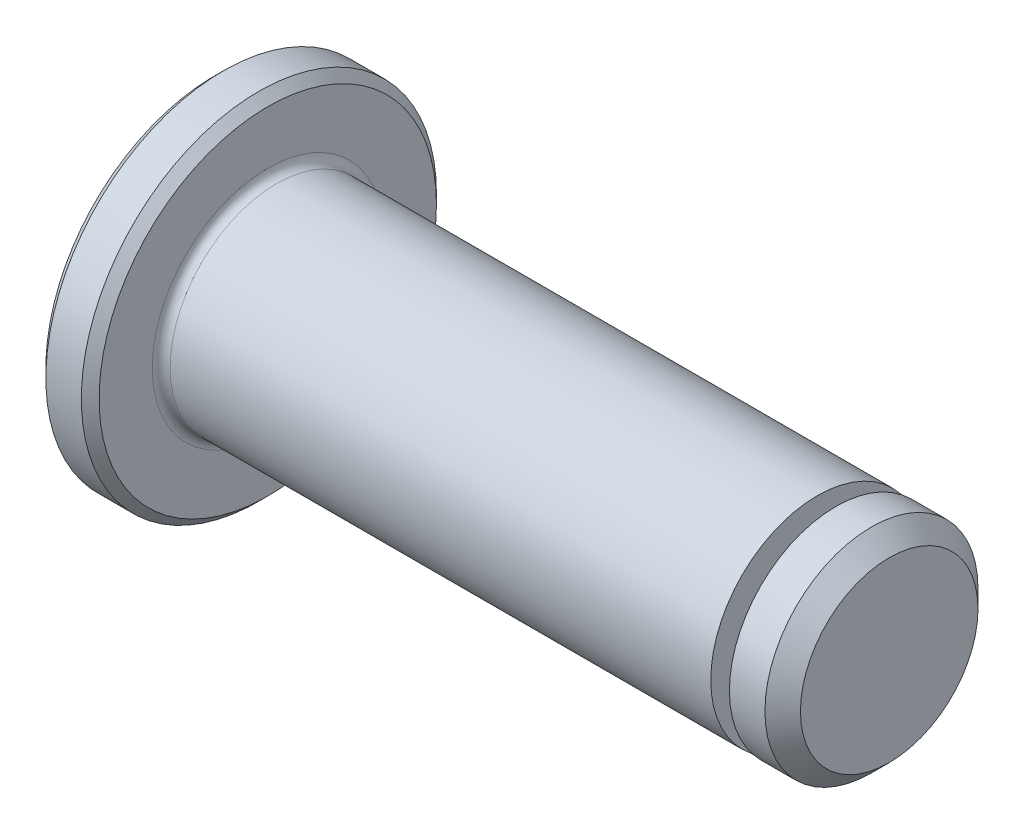
ISO-10303-21;
HEADER;
FILE_DESCRIPTION(('STEP AP214'),'2;1');
FILE_NAME('part.step','',(''),(''),'','','');
FILE_SCHEMA(('AUTOMOTIVE_DESIGN { 1 0 10303 214 1 1 1 1 }'));
ENDSEC;
DATA;
#1=APPLICATION_CONTEXT('core data for automotive mechanical design processes');
#2=APPLICATION_PROTOCOL_DEFINITION('international standard','automotive_design',2000,#1);
#3=PRODUCT_CONTEXT('',#1,'mechanical');
#4=PRODUCT('Part','Part','',(#3));
#5=PRODUCT_RELATED_PRODUCT_CATEGORY('part','',(#4));
#6=PRODUCT_DEFINITION_FORMATION('','',#4);
#7=PRODUCT_DEFINITION_CONTEXT('part definition',#1,'design');
#8=PRODUCT_DEFINITION('design','',#6,#7);
#9=PRODUCT_DEFINITION_SHAPE('','',#8);
#10=(LENGTH_UNIT() NAMED_UNIT(*) SI_UNIT(.MILLI.,.METRE.));
#11=(NAMED_UNIT(*) PLANE_ANGLE_UNIT() SI_UNIT($,.RADIAN.));
#12=(NAMED_UNIT(*) SI_UNIT($,.STERADIAN.) SOLID_ANGLE_UNIT());
#13=UNCERTAINTY_MEASURE_WITH_UNIT(LENGTH_MEASURE(1.E-05),#10,'distance_accuracy_value','');
#14=(GEOMETRIC_REPRESENTATION_CONTEXT(3) GLOBAL_UNCERTAINTY_ASSIGNED_CONTEXT((#13)) GLOBAL_UNIT_ASSIGNED_CONTEXT((#10,
#11,#12)) REPRESENTATION_CONTEXT('',''));
#15=CARTESIAN_POINT('',(0.,0.,0.));
#16=DIRECTION('',(0.,0.,1.));
#17=DIRECTION('',(1.,0.,0.));
#18=AXIS2_PLACEMENT_3D('',#15,#16,#17);
#19=CARTESIAN_POINT('',(38.,0.,0.));
#20=DIRECTION('',(-1.,0.,0.));
#21=DIRECTION('',(0.,0.,1.));
#22=AXIS2_PLACEMENT_3D('',#19,#20,#21);
#23=CYLINDRICAL_SURFACE('',#22,6.);
#24=CARTESIAN_POINT('',(3.5,0.,0.));
#25=DIRECTION('',(1.,0.,0.));
#26=DIRECTION('',(0.,0.,-1.));
#27=AXIS2_PLACEMENT_3D('',#24,#25,#26);
#28=CIRCLE('',#27,6.);
#29=CARTESIAN_POINT('',(3.5,0.,-6.));
#30=VERTEX_POINT('',#29);
#31=EDGE_CURVE('E47',#30,#30,#28,.T.);
#32=ORIENTED_EDGE('',*,*,#31,.T.);
#33=EDGE_LOOP('',(#32));
#34=FACE_BOUND('',#33,.T.);
#35=CARTESIAN_POINT('',(33.95,0.,0.));
#36=DIRECTION('',(-1.,0.,0.));
#37=DIRECTION('',(0.,0.,1.));
#38=AXIS2_PLACEMENT_3D('',#35,#36,#37);
#39=CIRCLE('',#38,6.);
#40=CARTESIAN_POINT('',(33.95,0.,6.));
#41=VERTEX_POINT('',#40);
#42=EDGE_CURVE('E87',#41,#41,#39,.T.);
#43=ORIENTED_EDGE('',*,*,#42,.T.);
#44=EDGE_LOOP('',(#43));
#45=FACE_BOUND('',#44,.T.);
#46=ADVANCED_FACE('F39',(#34,#45),#23,.T.);
#47=CARTESIAN_POINT('',(3.,0.,0.));
#48=DIRECTION('',(-1.,0.,0.));
#49=DIRECTION('',(0.,0.,1.));
#50=AXIS2_PLACEMENT_3D('',#47,#48,#49);
#51=CYLINDRICAL_SURFACE('',#50,10.);
#52=CARTESIAN_POINT('',(0.500000000000004,0.,0.));
#53=DIRECTION('',(1.,0.,0.));
#54=DIRECTION('',(0.,0.,-1.));
#55=AXIS2_PLACEMENT_3D('',#52,#53,#54);
#56=CIRCLE('',#55,10.);
#57=CARTESIAN_POINT('',(0.500000000000004,0.,-10.));
#58=VERTEX_POINT('',#57);
#59=EDGE_CURVE('E63',#58,#58,#56,.T.);
#60=ORIENTED_EDGE('',*,*,#59,.T.);
#61=EDGE_LOOP('',(#60));
#62=FACE_BOUND('',#61,.T.);
#63=CARTESIAN_POINT('',(2.5,0.,0.));
#64=DIRECTION('',(1.,0.,0.));
#65=DIRECTION('',(0.,0.,-1.));
#66=AXIS2_PLACEMENT_3D('',#63,#64,#65);
#67=CIRCLE('',#66,10.);
#68=CARTESIAN_POINT('',(2.5,0.,-10.));
#69=VERTEX_POINT('',#68);
#70=EDGE_CURVE('E67',#69,#69,#67,.F.);
#71=ORIENTED_EDGE('',*,*,#70,.T.);
#72=EDGE_LOOP('',(#71));
#73=FACE_BOUND('',#72,.T.);
#74=ADVANCED_FACE('F117',(#62,#73),#51,.T.);
#75=CARTESIAN_POINT('',(3.,0.,0.));
#76=DIRECTION('',(1.,0.,0.));
#77=DIRECTION('',(0.,0.,-1.));
#78=AXIS2_PLACEMENT_3D('',#75,#76,#77);
#79=PLANE('',#78);
#80=CARTESIAN_POINT('',(3.,0.,0.));
#81=DIRECTION('',(1.,0.,0.));
#82=DIRECTION('',(0.,0.,-1.));
#83=AXIS2_PLACEMENT_3D('',#80,#81,#82);
#84=CIRCLE('',#83,6.5);
#85=CARTESIAN_POINT('',(3.,0.,-6.5));
#86=VERTEX_POINT('',#85);
#87=EDGE_CURVE('E10',#86,#86,#84,.F.);
#88=ORIENTED_EDGE('',*,*,#87,.T.);
#89=EDGE_LOOP('',(#88));
#90=FACE_BOUND('',#89,.T.);
#91=CARTESIAN_POINT('',(3.,0.,0.));
#92=DIRECTION('',(1.,0.,0.));
#93=DIRECTION('',(0.,0.,-1.));
#94=AXIS2_PLACEMENT_3D('',#91,#92,#93);
#95=CIRCLE('',#94,9.49999999999999);
#96=CARTESIAN_POINT('',(3.,0.,-9.49999999999999));
#97=VERTEX_POINT('',#96);
#98=EDGE_CURVE('E52',#97,#97,#95,.T.);
#99=ORIENTED_EDGE('',*,*,#98,.T.);
#100=EDGE_LOOP('',(#99));
#101=FACE_BOUND('',#100,.T.);
#102=ADVANCED_FACE('F121',(#90,#101),#79,.T.);
#103=CARTESIAN_POINT('',(0.,0.,0.));
#104=DIRECTION('',(1.,0.,0.));
#105=DIRECTION('',(0.,0.,-1.));
#106=AXIS2_PLACEMENT_3D('',#103,#104,#105);
#107=PLANE('',#106);
#108=CARTESIAN_POINT('',(0.,0.,0.));
#109=DIRECTION('',(1.,0.,0.));
#110=DIRECTION('',(0.,0.,-1.));
#111=AXIS2_PLACEMENT_3D('',#108,#109,#110);
#112=CIRCLE('',#111,9.49999999999999);
#113=CARTESIAN_POINT('',(0.,0.,-9.49999999999999));
#114=VERTEX_POINT('',#113);
#115=EDGE_CURVE('E57',#114,#114,#112,.F.);
#116=ORIENTED_EDGE('',*,*,#115,.T.);
#117=EDGE_LOOP('',(#116));
#118=FACE_BOUND('',#117,.T.);
#119=ADVANCED_FACE('F138',(#118),#107,.F.);
#120=CARTESIAN_POINT('',(35.,6.,0.));
#121=DIRECTION('',(-1.,0.,0.));
#122=DIRECTION('',(0.,0.,1.));
#123=AXIS2_PLACEMENT_3D('',#120,#121,#122);
#124=PLANE('',#123);
#125=CARTESIAN_POINT('',(35.,0.,0.));
#126=DIRECTION('',(-1.,0.,0.));
#127=DIRECTION('',(0.,0.,1.));
#128=AXIS2_PLACEMENT_3D('',#125,#126,#127);
#129=CIRCLE('',#128,6.);
#130=CARTESIAN_POINT('',(35.,0.,6.));
#131=VERTEX_POINT('',#130);
#132=EDGE_CURVE('E91',#131,#131,#129,.T.);
#133=ORIENTED_EDGE('',*,*,#132,.T.);
#134=EDGE_LOOP('',(#133));
#135=FACE_BOUND('',#134,.T.);
#136=CARTESIAN_POINT('',(35.,0.,0.));
#137=DIRECTION('',(-1.,0.,0.));
#138=DIRECTION('',(0.,0.,1.));
#139=AXIS2_PLACEMENT_3D('',#136,#137,#138);
#140=CIRCLE('',#139,4.);
#141=CARTESIAN_POINT('',(35.,0.,4.));
#142=VERTEX_POINT('',#141);
#143=EDGE_CURVE('E79',#142,#142,#140,.T.);
#144=ORIENTED_EDGE('',*,*,#143,.F.);
#145=EDGE_LOOP('',(#144));
#146=FACE_BOUND('',#145,.T.);
#147=ADVANCED_FACE('F96',(#135,#146),#124,.T.);
#148=CARTESIAN_POINT('',(0.,0.,0.));
#149=DIRECTION('',(-1.,0.,0.));
#150=DIRECTION('',(0.,0.,1.));
#151=AXIS2_PLACEMENT_3D('',#148,#149,#150);
#152=CYLINDRICAL_SURFACE('',#151,4.);
#153=ORIENTED_EDGE('',*,*,#143,.T.);
#154=EDGE_LOOP('',(#153));
#155=FACE_BOUND('',#154,.T.);
#156=CARTESIAN_POINT('',(33.95,0.,0.));
#157=DIRECTION('',(-1.,0.,0.));
#158=DIRECTION('',(0.,0.,1.));
#159=AXIS2_PLACEMENT_3D('',#156,#157,#158);
#160=CIRCLE('',#159,4.);
#161=CARTESIAN_POINT('',(33.95,0.,4.));
#162=VERTEX_POINT('',#161);
#163=EDGE_CURVE('E83',#162,#162,#160,.T.);
#164=ORIENTED_EDGE('',*,*,#163,.F.);
#165=EDGE_LOOP('',(#164));
#166=FACE_BOUND('',#165,.T.);
#167=ADVANCED_FACE('F128',(#155,#166),#152,.T.);
#168=CARTESIAN_POINT('',(33.95,6.,0.));
#169=DIRECTION('',(1.,0.,0.));
#170=DIRECTION('',(0.,0.,-1.));
#171=AXIS2_PLACEMENT_3D('',#168,#169,#170);
#172=PLANE('',#171);
#173=ORIENTED_EDGE('',*,*,#163,.T.);
#174=EDGE_LOOP('',(#173));
#175=FACE_BOUND('',#174,.T.);
#176=ORIENTED_EDGE('',*,*,#42,.F.);
#177=EDGE_LOOP('',(#176));
#178=FACE_BOUND('',#177,.T.);
#179=ADVANCED_FACE('F112',(#175,#178),#172,.T.);
#180=CARTESIAN_POINT('',(38.,0.,0.));
#181=DIRECTION('',(1.,0.,0.));
#182=DIRECTION('',(0.,0.,-1.));
#183=AXIS2_PLACEMENT_3D('',#180,#181,#182);
#184=PLANE('',#183);
#185=CARTESIAN_POINT('',(38.,0.,0.));
#186=DIRECTION('',(1.,0.,0.));
#187=DIRECTION('',(0.,0.,-1.));
#188=AXIS2_PLACEMENT_3D('',#185,#186,#187);
#189=CIRCLE('',#188,5.);
#190=CARTESIAN_POINT('',(38.,0.,-5.));
#191=VERTEX_POINT('',#190);
#192=EDGE_CURVE('E75',#191,#191,#189,.T.);
#193=ORIENTED_EDGE('',*,*,#192,.T.);
#194=EDGE_LOOP('',(#193));
#195=FACE_BOUND('',#194,.T.);
#196=ADVANCED_FACE('F102',(#195),#184,.T.);
#197=CARTESIAN_POINT('',(37.,0.,0.));
#198=DIRECTION('',(1.,0.,0.));
#199=DIRECTION('',(0.,0.,-1.));
#200=AXIS2_PLACEMENT_3D('',#197,#198,#199);
#201=CIRCLE('',#200,6.);
#202=CARTESIAN_POINT('',(37.,0.,-6.));
#203=VERTEX_POINT('',#202);
#204=EDGE_CURVE('E71',#203,#203,#201,.F.);
#205=ORIENTED_EDGE('',*,*,#204,.T.);
#206=EDGE_LOOP('',(#205));
#207=FACE_BOUND('',#206,.T.);
#208=ORIENTED_EDGE('',*,*,#132,.F.);
#209=EDGE_LOOP('',(#208));
#210=FACE_BOUND('',#209,.T.);
#211=ADVANCED_FACE('F99',(#207,#210),#23,.T.);
#212=CARTESIAN_POINT('',(38.,0.,0.));
#213=DIRECTION('',(-1.,0.,0.));
#214=DIRECTION('',(0.,0.,1.));
#215=AXIS2_PLACEMENT_3D('',#212,#213,#214);
#216=CONICAL_SURFACE('',#215,5.,0.785398163397446);
#217=ORIENTED_EDGE('',*,*,#204,.F.);
#218=EDGE_LOOP('',(#217));
#219=FACE_BOUND('',#218,.T.);
#220=ORIENTED_EDGE('',*,*,#192,.F.);
#221=EDGE_LOOP('',(#220));
#222=FACE_BOUND('',#221,.T.);
#223=ADVANCED_FACE('F101',(#219,#222),#216,.T.);
#224=CARTESIAN_POINT('',(0.500000000000004,0.,0.));
#225=DIRECTION('',(1.,0.,0.));
#226=DIRECTION('',(0.,0.,-1.));
#227=AXIS2_PLACEMENT_3D('',#224,#225,#226);
#228=CONICAL_SURFACE('',#227,10.,0.785398163397448);
#229=ORIENTED_EDGE('',*,*,#115,.F.);
#230=EDGE_LOOP('',(#229));
#231=FACE_BOUND('',#230,.T.);
#232=ORIENTED_EDGE('',*,*,#59,.F.);
#233=EDGE_LOOP('',(#232));
#234=FACE_BOUND('',#233,.T.);
#235=ADVANCED_FACE('F109',(#231,#234),#228,.T.);
#236=CARTESIAN_POINT('',(3.,0.,0.));
#237=DIRECTION('',(-1.,0.,0.));
#238=DIRECTION('',(0.,0.,1.));
#239=AXIS2_PLACEMENT_3D('',#236,#237,#238);
#240=CONICAL_SURFACE('',#239,9.49999999999999,0.785398163397448);
#241=ORIENTED_EDGE('',*,*,#70,.F.);
#242=EDGE_LOOP('',(#241));
#243=FACE_BOUND('',#242,.T.);
#244=ORIENTED_EDGE('',*,*,#98,.F.);
#245=EDGE_LOOP('',(#244));
#246=FACE_BOUND('',#245,.T.);
#247=ADVANCED_FACE('F156',(#243,#246),#240,.T.);
#248=CARTESIAN_POINT('',(3.5,0.,0.));
#249=DIRECTION('',(1.,0.,0.));
#250=DIRECTION('',(0.,0.,-1.));
#251=AXIS2_PLACEMENT_3D('',#248,#249,#250);
#252=TOROIDAL_SURFACE('',#251,6.5,0.5);
#253=ORIENTED_EDGE('',*,*,#87,.F.);
#254=EDGE_LOOP('',(#253));
#255=FACE_BOUND('',#254,.T.);
#256=ORIENTED_EDGE('',*,*,#31,.F.);
#257=EDGE_LOOP('',(#256));
#258=FACE_BOUND('',#257,.T.);
#259=ADVANCED_FACE('F41',(#255,#258),#252,.F.);
#260=CLOSED_SHELL('',(#46,#74,#102,#119,#147,#167,#179,#196,#211,#223,#235,#247,#259));
#261=MANIFOLD_SOLID_BREP('B2',#260);
#262=ADVANCED_BREP_SHAPE_REPRESENTATION('',(#18,#261),#14);
#263=SHAPE_DEFINITION_REPRESENTATION(#9,#262);
ENDSEC;
END-ISO-10303-21;
